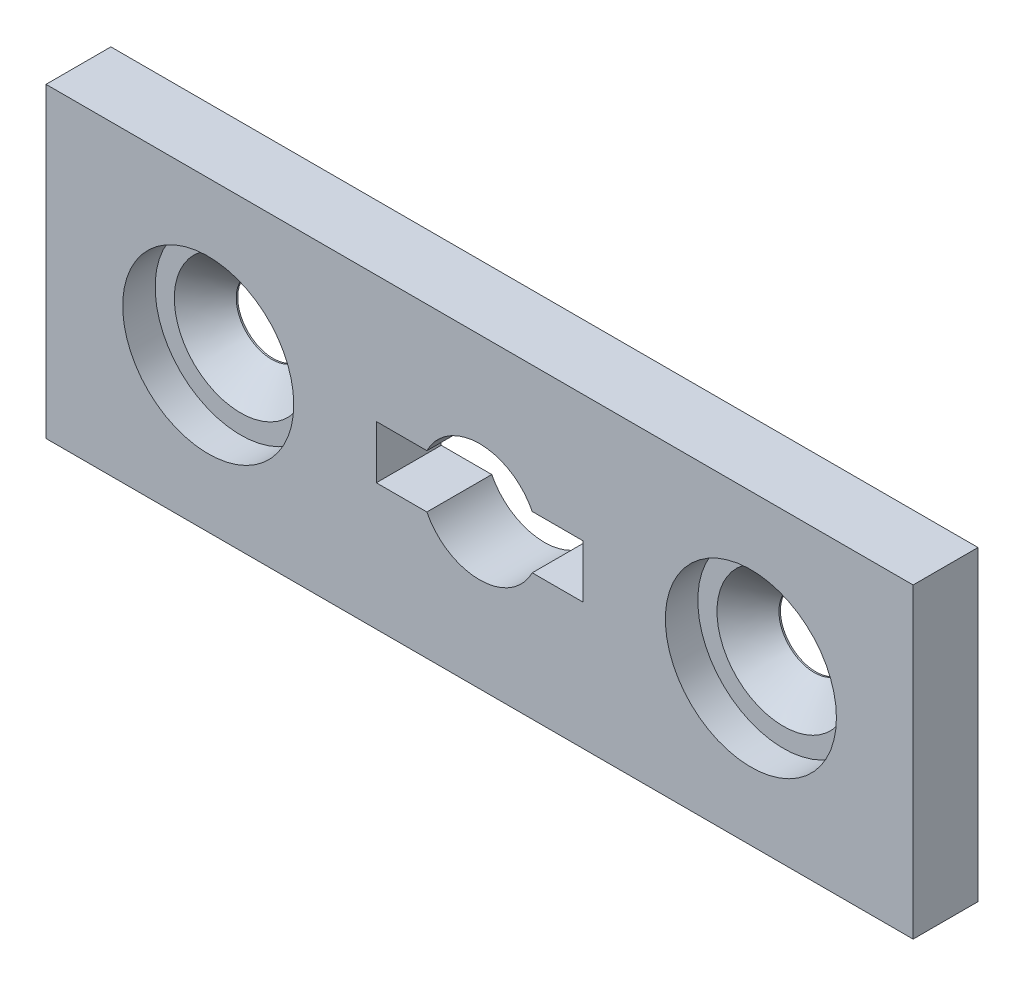
ISO-10303-21;
HEADER;
FILE_DESCRIPTION(('STEP AP214'),'2;1');
FILE_NAME('part.step','',(''),(''),'','','');
FILE_SCHEMA(('AUTOMOTIVE_DESIGN { 1 0 10303 214 1 1 1 1 }'));
ENDSEC;
DATA;
#1=APPLICATION_CONTEXT('core data for automotive mechanical design processes');
#2=APPLICATION_PROTOCOL_DEFINITION('international standard','automotive_design',2000,#1);
#3=PRODUCT_CONTEXT('',#1,'mechanical');
#4=PRODUCT('Part','Part','',(#3));
#5=PRODUCT_RELATED_PRODUCT_CATEGORY('part','',(#4));
#6=PRODUCT_DEFINITION_FORMATION('','',#4);
#7=PRODUCT_DEFINITION_CONTEXT('part definition',#1,'design');
#8=PRODUCT_DEFINITION('design','',#6,#7);
#9=PRODUCT_DEFINITION_SHAPE('','',#8);
#10=(LENGTH_UNIT() NAMED_UNIT(*) SI_UNIT(.MILLI.,.METRE.));
#11=(NAMED_UNIT(*) PLANE_ANGLE_UNIT() SI_UNIT($,.RADIAN.));
#12=(NAMED_UNIT(*) SI_UNIT($,.STERADIAN.) SOLID_ANGLE_UNIT());
#13=UNCERTAINTY_MEASURE_WITH_UNIT(LENGTH_MEASURE(1.E-05),#10,'distance_accuracy_value','');
#14=(GEOMETRIC_REPRESENTATION_CONTEXT(3) GLOBAL_UNCERTAINTY_ASSIGNED_CONTEXT((#13)) GLOBAL_UNIT_ASSIGNED_CONTEXT((#10,
#11,#12)) REPRESENTATION_CONTEXT('',''));
#15=CARTESIAN_POINT('',(0.,0.,0.));
#16=DIRECTION('',(0.,0.,1.));
#17=DIRECTION('',(1.,0.,0.));
#18=AXIS2_PLACEMENT_3D('',#15,#16,#17);
#19=CARTESIAN_POINT('',(0.,0.,-2.2));
#20=DIRECTION('',(0.,0.,1.));
#21=DIRECTION('',(1.,0.,0.));
#22=AXIS2_PLACEMENT_3D('',#19,#20,#21);
#23=CYLINDRICAL_SURFACE('',#22,2.);
#24=CARTESIAN_POINT('',(0.,0.,0.));
#25=DIRECTION('',(0.,0.,1.));
#26=DIRECTION('',(1.,0.,0.));
#27=AXIS2_PLACEMENT_3D('',#24,#25,#26);
#28=CIRCLE('',#27,2.);
#29=CARTESIAN_POINT('',(-1.78605710994918,-0.9,0.));
#30=VERTEX_POINT('',#29);
#31=CARTESIAN_POINT('',(1.78605710994918,-0.9,0.));
#32=VERTEX_POINT('',#31);
#33=EDGE_CURVE('E168',#30,#32,#28,.T.);
#34=ORIENTED_EDGE('',*,*,#33,.T.);
#35=DIRECTION('',(0.,0.,1.));
#36=VECTOR('',#35,1.);
#37=CARTESIAN_POINT('',(1.78605710994918,-0.9,-2.2));
#38=LINE('',#37,#36);
#39=CARTESIAN_POINT('',(1.78605710994918,-0.9,-2.2));
#40=VERTEX_POINT('',#39);
#41=EDGE_CURVE('E11',#32,#40,#38,.F.);
#42=ORIENTED_EDGE('',*,*,#41,.T.);
#43=CARTESIAN_POINT('',(0.,0.,-2.2));
#44=DIRECTION('',(0.,0.,1.));
#45=DIRECTION('',(1.,0.,0.));
#46=AXIS2_PLACEMENT_3D('',#43,#44,#45);
#47=CIRCLE('',#46,2.);
#48=CARTESIAN_POINT('',(-1.78605710994918,-0.9,-2.2));
#49=VERTEX_POINT('',#48);
#50=EDGE_CURVE('E176',#49,#40,#47,.T.);
#51=ORIENTED_EDGE('',*,*,#50,.F.);
#52=DIRECTION('',(0.,0.,1.));
#53=VECTOR('',#52,1.);
#54=CARTESIAN_POINT('',(-1.78605710994918,-0.9,-2.2));
#55=LINE('',#54,#53);
#56=EDGE_CURVE('E41',#49,#30,#55,.T.);
#57=ORIENTED_EDGE('',*,*,#56,.T.);
#58=EDGE_LOOP('',(#34,#42,#51,#57));
#59=FACE_BOUND('',#58,.T.);
#60=ADVANCED_FACE('F33',(#59),#23,.F.);
#61=CARTESIAN_POINT('',(14.7,-5.2,-2.2));
#62=DIRECTION('',(1.,0.,0.));
#63=DIRECTION('',(0.,0.,-1.));
#64=AXIS2_PLACEMENT_3D('',#61,#62,#63);
#65=PLANE('',#64);
#66=DIRECTION('',(0.,1.,0.));
#67=VECTOR('',#66,1.);
#68=CARTESIAN_POINT('',(14.7,-5.2,0.));
#69=LINE('',#68,#67);
#70=CARTESIAN_POINT('',(14.7,-5.2,0.));
#71=VERTEX_POINT('',#70);
#72=CARTESIAN_POINT('',(14.7,5.2,0.));
#73=VERTEX_POINT('',#72);
#74=EDGE_CURVE('E175',#71,#73,#69,.T.);
#75=ORIENTED_EDGE('',*,*,#74,.F.);
#76=DIRECTION('',(0.,0.,1.));
#77=VECTOR('',#76,1.);
#78=CARTESIAN_POINT('',(14.7,-5.2,-2.2));
#79=LINE('',#78,#77);
#80=CARTESIAN_POINT('',(14.7,-5.2,-2.2));
#81=VERTEX_POINT('',#80);
#82=EDGE_CURVE('E204',#81,#71,#79,.T.);
#83=ORIENTED_EDGE('',*,*,#82,.F.);
#84=DIRECTION('',(0.,1.,0.));
#85=VECTOR('',#84,1.);
#86=CARTESIAN_POINT('',(14.7,-5.2,-2.2));
#87=LINE('',#86,#85);
#88=CARTESIAN_POINT('',(14.7,5.2,-2.2));
#89=VERTEX_POINT('',#88);
#90=EDGE_CURVE('E180',#81,#89,#87,.T.);
#91=ORIENTED_EDGE('',*,*,#90,.T.);
#92=DIRECTION('',(0.,0.,1.));
#93=VECTOR('',#92,1.);
#94=CARTESIAN_POINT('',(14.7,5.2,-2.2));
#95=LINE('',#94,#93);
#96=EDGE_CURVE('E193',#89,#73,#95,.T.);
#97=ORIENTED_EDGE('',*,*,#96,.T.);
#98=EDGE_LOOP('',(#75,#83,#91,#97));
#99=FACE_BOUND('',#98,.T.);
#100=ADVANCED_FACE('F35',(#99),#65,.T.);
#101=CARTESIAN_POINT('',(-14.7,-5.2,-2.2));
#102=DIRECTION('',(0.,-1.,0.));
#103=DIRECTION('',(0.,0.,-1.));
#104=AXIS2_PLACEMENT_3D('',#101,#102,#103);
#105=PLANE('',#104);
#106=DIRECTION('',(1.,0.,0.));
#107=VECTOR('',#106,1.);
#108=CARTESIAN_POINT('',(-14.7,-5.2,0.));
#109=LINE('',#108,#107);
#110=CARTESIAN_POINT('',(-14.7,-5.2,0.));
#111=VERTEX_POINT('',#110);
#112=EDGE_CURVE('E184',#111,#71,#109,.T.);
#113=ORIENTED_EDGE('',*,*,#112,.F.);
#114=DIRECTION('',(0.,0.,1.));
#115=VECTOR('',#114,1.);
#116=CARTESIAN_POINT('',(-14.7,-5.2,-2.2));
#117=LINE('',#116,#115);
#118=CARTESIAN_POINT('',(-14.7,-5.2,-2.2));
#119=VERTEX_POINT('',#118);
#120=EDGE_CURVE('E206',#119,#111,#117,.T.);
#121=ORIENTED_EDGE('',*,*,#120,.F.);
#122=DIRECTION('',(1.,0.,0.));
#123=VECTOR('',#122,1.);
#124=CARTESIAN_POINT('',(-14.7,-5.2,-2.2));
#125=LINE('',#124,#123);
#126=EDGE_CURVE('E190',#119,#81,#125,.T.);
#127=ORIENTED_EDGE('',*,*,#126,.T.);
#128=ORIENTED_EDGE('',*,*,#82,.T.);
#129=EDGE_LOOP('',(#113,#121,#127,#128));
#130=FACE_BOUND('',#129,.T.);
#131=ADVANCED_FACE('F253',(#130),#105,.T.);
#132=CARTESIAN_POINT('',(-14.7,-5.2,-2.2));
#133=DIRECTION('',(-1.,0.,0.));
#134=DIRECTION('',(0.,0.,1.));
#135=AXIS2_PLACEMENT_3D('',#132,#133,#134);
#136=PLANE('',#135);
#137=DIRECTION('',(0.,-1.,0.));
#138=VECTOR('',#137,1.);
#139=CARTESIAN_POINT('',(-14.7,-5.2,0.));
#140=LINE('',#139,#138);
#141=CARTESIAN_POINT('',(-14.7,5.2,0.));
#142=VERTEX_POINT('',#141);
#143=EDGE_CURVE('E199',#142,#111,#140,.T.);
#144=ORIENTED_EDGE('',*,*,#143,.F.);
#145=DIRECTION('',(0.,0.,1.));
#146=VECTOR('',#145,1.);
#147=CARTESIAN_POINT('',(-14.7,5.2,-2.2));
#148=LINE('',#147,#146);
#149=CARTESIAN_POINT('',(-14.7,5.2,-2.2));
#150=VERTEX_POINT('',#149);
#151=EDGE_CURVE('E208',#150,#142,#148,.T.);
#152=ORIENTED_EDGE('',*,*,#151,.F.);
#153=DIRECTION('',(0.,-1.,0.));
#154=VECTOR('',#153,1.);
#155=CARTESIAN_POINT('',(-14.7,-5.2,-2.2));
#156=LINE('',#155,#154);
#157=EDGE_CURVE('E187',#150,#119,#156,.T.);
#158=ORIENTED_EDGE('',*,*,#157,.T.);
#159=ORIENTED_EDGE('',*,*,#120,.T.);
#160=EDGE_LOOP('',(#144,#152,#158,#159));
#161=FACE_BOUND('',#160,.T.);
#162=ADVANCED_FACE('F272',(#161),#136,.T.);
#163=CARTESIAN_POINT('',(-14.7,5.2,-2.2));
#164=DIRECTION('',(0.,1.,0.));
#165=DIRECTION('',(0.,0.,1.));
#166=AXIS2_PLACEMENT_3D('',#163,#164,#165);
#167=PLANE('',#166);
#168=DIRECTION('',(-1.,0.,0.));
#169=VECTOR('',#168,1.);
#170=CARTESIAN_POINT('',(-14.7,5.2,0.));
#171=LINE('',#170,#169);
#172=EDGE_CURVE('E196',#73,#142,#171,.T.);
#173=ORIENTED_EDGE('',*,*,#172,.F.);
#174=ORIENTED_EDGE('',*,*,#96,.F.);
#175=DIRECTION('',(-1.,0.,0.));
#176=VECTOR('',#175,1.);
#177=CARTESIAN_POINT('',(-14.7,5.2,-2.2));
#178=LINE('',#177,#176);
#179=EDGE_CURVE('E183',#89,#150,#178,.T.);
#180=ORIENTED_EDGE('',*,*,#179,.T.);
#181=ORIENTED_EDGE('',*,*,#151,.T.);
#182=EDGE_LOOP('',(#173,#174,#180,#181));
#183=FACE_BOUND('',#182,.T.);
#184=ADVANCED_FACE('F265',(#183),#167,.T.);
#185=CARTESIAN_POINT('',(14.7,5.2,-2.2));
#186=DIRECTION('',(0.,0.,-1.));
#187=DIRECTION('',(-1.,0.,0.));
#188=AXIS2_PLACEMENT_3D('',#185,#186,#187);
#189=PLANE('',#188);
#190=CARTESIAN_POINT('',(9.2,0.,-2.2));
#191=DIRECTION('',(0.,0.,1.));
#192=DIRECTION('',(1.,0.,0.));
#193=AXIS2_PLACEMENT_3D('',#190,#191,#192);
#194=CIRCLE('',#193,1.2);
#195=CARTESIAN_POINT('',(10.4,0.,-2.2));
#196=VERTEX_POINT('',#195);
#197=EDGE_CURVE('E480',#196,#196,#194,.T.);
#198=ORIENTED_EDGE('',*,*,#197,.T.);
#199=EDGE_LOOP('',(#198));
#200=FACE_BOUND('',#199,.T.);
#201=CARTESIAN_POINT('',(-9.2,0.,-2.2));
#202=DIRECTION('',(0.,0.,1.));
#203=DIRECTION('',(1.,0.,0.));
#204=AXIS2_PLACEMENT_3D('',#201,#202,#203);
#205=CIRCLE('',#204,1.2);
#206=CARTESIAN_POINT('',(-8.,0.,-2.2));
#207=VERTEX_POINT('',#206);
#208=EDGE_CURVE('E469',#207,#207,#205,.T.);
#209=ORIENTED_EDGE('',*,*,#208,.T.);
#210=EDGE_LOOP('',(#209));
#211=FACE_BOUND('',#210,.T.);
#212=DIRECTION('',(1.,0.,0.));
#213=VECTOR('',#212,1.);
#214=CARTESIAN_POINT('',(-3.5,-0.9,-2.2));
#215=LINE('',#214,#213);
#216=CARTESIAN_POINT('',(-3.5,-0.9,-2.2));
#217=VERTEX_POINT('',#216);
#218=EDGE_CURVE('E132',#217,#49,#215,.T.);
#219=ORIENTED_EDGE('',*,*,#218,.T.);
#220=ORIENTED_EDGE('',*,*,#50,.T.);
#221=CARTESIAN_POINT('',(3.5,-0.9,-2.2));
#222=VERTEX_POINT('',#221);
#223=EDGE_CURVE('E147',#40,#222,#215,.T.);
#224=ORIENTED_EDGE('',*,*,#223,.T.);
#225=DIRECTION('',(0.,1.,0.));
#226=VECTOR('',#225,1.);
#227=CARTESIAN_POINT('',(3.5,-0.9,-2.2));
#228=LINE('',#227,#226);
#229=CARTESIAN_POINT('',(3.5,0.9,-2.2));
#230=VERTEX_POINT('',#229);
#231=EDGE_CURVE('E127',#222,#230,#228,.T.);
#232=ORIENTED_EDGE('',*,*,#231,.T.);
#233=DIRECTION('',(-1.,0.,0.));
#234=VECTOR('',#233,1.);
#235=CARTESIAN_POINT('',(-3.5,0.9,-2.2));
#236=LINE('',#235,#234);
#237=CARTESIAN_POINT('',(1.78605710994918,0.9,-2.2));
#238=VERTEX_POINT('',#237);
#239=EDGE_CURVE('E135',#230,#238,#236,.T.);
#240=ORIENTED_EDGE('',*,*,#239,.T.);
#241=CARTESIAN_POINT('',(-1.78605710994918,0.9,-2.2));
#242=VERTEX_POINT('',#241);
#243=EDGE_CURVE('E173',#238,#242,#47,.T.);
#244=ORIENTED_EDGE('',*,*,#243,.T.);
#245=CARTESIAN_POINT('',(-3.5,0.9,-2.2));
#246=VERTEX_POINT('',#245);
#247=EDGE_CURVE('E56',#242,#246,#236,.T.);
#248=ORIENTED_EDGE('',*,*,#247,.T.);
#249=DIRECTION('',(0.,-1.,0.));
#250=VECTOR('',#249,1.);
#251=CARTESIAN_POINT('',(-3.5,-0.9,-2.2));
#252=LINE('',#251,#250);
#253=EDGE_CURVE('E141',#246,#217,#252,.T.);
#254=ORIENTED_EDGE('',*,*,#253,.T.);
#255=EDGE_LOOP('',(#219,#220,#224,#232,#240,#244,#248,#254));
#256=FACE_BOUND('',#255,.T.);
#257=ORIENTED_EDGE('',*,*,#90,.F.);
#258=ORIENTED_EDGE('',*,*,#126,.F.);
#259=ORIENTED_EDGE('',*,*,#157,.F.);
#260=ORIENTED_EDGE('',*,*,#179,.F.);
#261=EDGE_LOOP('',(#257,#258,#259,#260));
#262=FACE_BOUND('',#261,.T.);
#263=ADVANCED_FACE('F144',(#200,#211,#256,#262),#189,.T.);
#264=CARTESIAN_POINT('',(14.7,5.2,0.));
#265=DIRECTION('',(0.,0.,-1.));
#266=DIRECTION('',(-1.,0.,0.));
#267=AXIS2_PLACEMENT_3D('',#264,#265,#266);
#268=PLANE('',#267);
#269=CARTESIAN_POINT('',(-9.2,0.,0.));
#270=DIRECTION('',(0.,0.,1.));
#271=DIRECTION('',(1.,0.,0.));
#272=AXIS2_PLACEMENT_3D('',#269,#270,#271);
#273=CIRCLE('',#272,2.9);
#274=CARTESIAN_POINT('',(-6.3,0.,0.));
#275=VERTEX_POINT('',#274);
#276=EDGE_CURVE('E464',#275,#275,#273,.T.);
#277=ORIENTED_EDGE('',*,*,#276,.F.);
#278=EDGE_LOOP('',(#277));
#279=FACE_BOUND('',#278,.T.);
#280=CARTESIAN_POINT('',(9.2,0.,0.));
#281=DIRECTION('',(0.,0.,1.));
#282=DIRECTION('',(1.,0.,0.));
#283=AXIS2_PLACEMENT_3D('',#280,#281,#282);
#284=CIRCLE('',#283,2.9);
#285=CARTESIAN_POINT('',(12.1,0.,0.));
#286=VERTEX_POINT('',#285);
#287=EDGE_CURVE('E153',#286,#286,#284,.T.);
#288=ORIENTED_EDGE('',*,*,#287,.F.);
#289=EDGE_LOOP('',(#288));
#290=FACE_BOUND('',#289,.T.);
#291=ORIENTED_EDGE('',*,*,#33,.F.);
#292=DIRECTION('',(1.,0.,0.));
#293=VECTOR('',#292,1.);
#294=CARTESIAN_POINT('',(-3.5,-0.9,0.));
#295=LINE('',#294,#293);
#296=CARTESIAN_POINT('',(-3.5,-0.9,0.));
#297=VERTEX_POINT('',#296);
#298=EDGE_CURVE('E148',#297,#30,#295,.T.);
#299=ORIENTED_EDGE('',*,*,#298,.F.);
#300=DIRECTION('',(0.,-1.,0.));
#301=VECTOR('',#300,1.);
#302=CARTESIAN_POINT('',(-3.5,-0.9,0.));
#303=LINE('',#302,#301);
#304=CARTESIAN_POINT('',(-3.5,0.9,0.));
#305=VERTEX_POINT('',#304);
#306=EDGE_CURVE('E163',#305,#297,#303,.T.);
#307=ORIENTED_EDGE('',*,*,#306,.F.);
#308=DIRECTION('',(-1.,0.,0.));
#309=VECTOR('',#308,1.);
#310=CARTESIAN_POINT('',(-3.5,0.9,0.));
#311=LINE('',#310,#309);
#312=CARTESIAN_POINT('',(-1.78605710994918,0.9,0.));
#313=VERTEX_POINT('',#312);
#314=EDGE_CURVE('E160',#313,#305,#311,.T.);
#315=ORIENTED_EDGE('',*,*,#314,.F.);
#316=CARTESIAN_POINT('',(1.78605710994918,0.9,0.));
#317=VERTEX_POINT('',#316);
#318=EDGE_CURVE('E177',#317,#313,#28,.T.);
#319=ORIENTED_EDGE('',*,*,#318,.F.);
#320=CARTESIAN_POINT('',(3.5,0.9,0.));
#321=VERTEX_POINT('',#320);
#322=EDGE_CURVE('E48',#321,#317,#311,.T.);
#323=ORIENTED_EDGE('',*,*,#322,.F.);
#324=DIRECTION('',(0.,1.,0.));
#325=VECTOR('',#324,1.);
#326=CARTESIAN_POINT('',(3.5,-0.9,0.));
#327=LINE('',#326,#325);
#328=CARTESIAN_POINT('',(3.5,-0.9,0.));
#329=VERTEX_POINT('',#328);
#330=EDGE_CURVE('E130',#329,#321,#327,.T.);
#331=ORIENTED_EDGE('',*,*,#330,.F.);
#332=EDGE_CURVE('E150',#32,#329,#295,.T.);
#333=ORIENTED_EDGE('',*,*,#332,.F.);
#334=EDGE_LOOP('',(#291,#299,#307,#315,#319,#323,#331,#333));
#335=FACE_BOUND('',#334,.T.);
#336=ORIENTED_EDGE('',*,*,#74,.T.);
#337=ORIENTED_EDGE('',*,*,#172,.T.);
#338=ORIENTED_EDGE('',*,*,#143,.T.);
#339=ORIENTED_EDGE('',*,*,#112,.T.);
#340=EDGE_LOOP('',(#336,#337,#338,#339));
#341=FACE_BOUND('',#340,.T.);
#342=ADVANCED_FACE('F223',(#279,#290,#335,#341),#268,.F.);
#343=ORIENTED_EDGE('',*,*,#318,.T.);
#344=DIRECTION('',(0.,0.,1.));
#345=VECTOR('',#344,1.);
#346=CARTESIAN_POINT('',(-1.78605710994918,0.9,-2.2));
#347=LINE('',#346,#345);
#348=EDGE_CURVE('E212',#313,#242,#347,.F.);
#349=ORIENTED_EDGE('',*,*,#348,.T.);
#350=ORIENTED_EDGE('',*,*,#243,.F.);
#351=DIRECTION('',(0.,0.,1.));
#352=VECTOR('',#351,1.);
#353=CARTESIAN_POINT('',(1.78605710994918,0.9,-2.2));
#354=LINE('',#353,#352);
#355=EDGE_CURVE('E137',#238,#317,#354,.T.);
#356=ORIENTED_EDGE('',*,*,#355,.T.);
#357=EDGE_LOOP('',(#343,#349,#350,#356));
#358=FACE_BOUND('',#357,.T.);
#359=ADVANCED_FACE('F235',(#358),#23,.F.);
#360=CARTESIAN_POINT('',(-3.5,0.9,-2.2));
#361=DIRECTION('',(0.,1.,0.));
#362=DIRECTION('',(0.,0.,1.));
#363=AXIS2_PLACEMENT_3D('',#360,#361,#362);
#364=PLANE('',#363);
#365=ORIENTED_EDGE('',*,*,#239,.F.);
#366=DIRECTION('',(0.,0.,1.));
#367=VECTOR('',#366,1.);
#368=CARTESIAN_POINT('',(3.5,0.9,-2.2));
#369=LINE('',#368,#367);
#370=EDGE_CURVE('E122',#230,#321,#369,.T.);
#371=ORIENTED_EDGE('',*,*,#370,.T.);
#372=ORIENTED_EDGE('',*,*,#322,.T.);
#373=ORIENTED_EDGE('',*,*,#355,.F.);
#374=EDGE_LOOP('',(#365,#371,#372,#373));
#375=FACE_BOUND('',#374,.T.);
#376=ADVANCED_FACE('F136',(#375),#364,.F.);
#377=CARTESIAN_POINT('',(-3.5,-0.9,-2.2));
#378=DIRECTION('',(0.,-1.,0.));
#379=DIRECTION('',(0.,0.,-1.));
#380=AXIS2_PLACEMENT_3D('',#377,#378,#379);
#381=PLANE('',#380);
#382=ORIENTED_EDGE('',*,*,#332,.T.);
#383=DIRECTION('',(0.,0.,1.));
#384=VECTOR('',#383,1.);
#385=CARTESIAN_POINT('',(3.5,-0.9,-2.2));
#386=LINE('',#385,#384);
#387=EDGE_CURVE('E166',#222,#329,#386,.T.);
#388=ORIENTED_EDGE('',*,*,#387,.F.);
#389=ORIENTED_EDGE('',*,*,#223,.F.);
#390=ORIENTED_EDGE('',*,*,#41,.F.);
#391=EDGE_LOOP('',(#382,#388,#389,#390));
#392=FACE_BOUND('',#391,.T.);
#393=ADVANCED_FACE('F227',(#392),#381,.F.);
#394=CARTESIAN_POINT('',(3.5,-0.9,-2.2));
#395=DIRECTION('',(1.,0.,0.));
#396=DIRECTION('',(0.,0.,-1.));
#397=AXIS2_PLACEMENT_3D('',#394,#395,#396);
#398=PLANE('',#397);
#399=ORIENTED_EDGE('',*,*,#330,.T.);
#400=ORIENTED_EDGE('',*,*,#370,.F.);
#401=ORIENTED_EDGE('',*,*,#231,.F.);
#402=ORIENTED_EDGE('',*,*,#387,.T.);
#403=EDGE_LOOP('',(#399,#400,#401,#402));
#404=FACE_BOUND('',#403,.T.);
#405=ADVANCED_FACE('F124',(#404),#398,.F.);
#406=ORIENTED_EDGE('',*,*,#218,.F.);
#407=DIRECTION('',(0.,0.,1.));
#408=VECTOR('',#407,1.);
#409=CARTESIAN_POINT('',(-3.5,-0.9,-2.2));
#410=LINE('',#409,#408);
#411=EDGE_CURVE('E169',#217,#297,#410,.T.);
#412=ORIENTED_EDGE('',*,*,#411,.T.);
#413=ORIENTED_EDGE('',*,*,#298,.T.);
#414=ORIENTED_EDGE('',*,*,#56,.F.);
#415=EDGE_LOOP('',(#406,#412,#413,#414));
#416=FACE_BOUND('',#415,.T.);
#417=ADVANCED_FACE('F229',(#416),#381,.F.);
#418=ORIENTED_EDGE('',*,*,#314,.T.);
#419=DIRECTION('',(0.,0.,1.));
#420=VECTOR('',#419,1.);
#421=CARTESIAN_POINT('',(-3.5,0.9,-2.2));
#422=LINE('',#421,#420);
#423=EDGE_CURVE('E131',#246,#305,#422,.T.);
#424=ORIENTED_EDGE('',*,*,#423,.F.);
#425=ORIENTED_EDGE('',*,*,#247,.F.);
#426=ORIENTED_EDGE('',*,*,#348,.F.);
#427=EDGE_LOOP('',(#418,#424,#425,#426));
#428=FACE_BOUND('',#427,.T.);
#429=ADVANCED_FACE('F236',(#428),#364,.F.);
#430=CARTESIAN_POINT('',(-3.5,-0.9,-2.2));
#431=DIRECTION('',(-1.,0.,0.));
#432=DIRECTION('',(0.,0.,1.));
#433=AXIS2_PLACEMENT_3D('',#430,#431,#432);
#434=PLANE('',#433);
#435=ORIENTED_EDGE('',*,*,#306,.T.);
#436=ORIENTED_EDGE('',*,*,#411,.F.);
#437=ORIENTED_EDGE('',*,*,#253,.F.);
#438=ORIENTED_EDGE('',*,*,#423,.T.);
#439=EDGE_LOOP('',(#435,#436,#437,#438));
#440=FACE_BOUND('',#439,.T.);
#441=ADVANCED_FACE('F231',(#440),#434,.F.);
#442=CARTESIAN_POINT('',(9.2,0.,-1.1));
#443=DIRECTION('',(0.,0.,1.));
#444=DIRECTION('',(1.,0.,0.));
#445=AXIS2_PLACEMENT_3D('',#442,#443,#444);
#446=CYLINDRICAL_SURFACE('',#445,2.9);
#447=CARTESIAN_POINT('',(9.2,0.,-1.1));
#448=DIRECTION('',(0.,0.,1.));
#449=DIRECTION('',(1.,0.,0.));
#450=AXIS2_PLACEMENT_3D('',#447,#448,#449);
#451=CIRCLE('',#450,2.9);
#452=CARTESIAN_POINT('',(12.1,0.,-1.1));
#453=VERTEX_POINT('',#452);
#454=EDGE_CURVE('E161',#453,#453,#451,.T.);
#455=ORIENTED_EDGE('',*,*,#454,.F.);
#456=EDGE_LOOP('',(#455));
#457=FACE_BOUND('',#456,.T.);
#458=ORIENTED_EDGE('',*,*,#287,.T.);
#459=EDGE_LOOP('',(#458));
#460=FACE_BOUND('',#459,.T.);
#461=ADVANCED_FACE('F243',(#457,#460),#446,.F.);
#462=CARTESIAN_POINT('',(9.2,0.,-1.1));
#463=DIRECTION('',(0.,0.,1.));
#464=DIRECTION('',(1.,0.,0.));
#465=AXIS2_PLACEMENT_3D('',#462,#463,#464);
#466=PLANE('',#465);
#467=CARTESIAN_POINT('',(9.2,0.,-1.1));
#468=DIRECTION('',(0.,0.,1.));
#469=DIRECTION('',(1.,0.,0.));
#470=AXIS2_PLACEMENT_3D('',#467,#468,#469);
#471=CIRCLE('',#470,2.25);
#472=CARTESIAN_POINT('',(11.45,0.,-1.1));
#473=VERTEX_POINT('',#472);
#474=EDGE_CURVE('E486',#473,#473,#471,.T.);
#475=ORIENTED_EDGE('',*,*,#474,.F.);
#476=EDGE_LOOP('',(#475));
#477=FACE_BOUND('',#476,.T.);
#478=ORIENTED_EDGE('',*,*,#454,.T.);
#479=EDGE_LOOP('',(#478));
#480=FACE_BOUND('',#479,.T.);
#481=ADVANCED_FACE('F307',(#477,#480),#466,.T.);
#482=CARTESIAN_POINT('',(-9.2,0.,-1.1));
#483=DIRECTION('',(0.,0.,1.));
#484=DIRECTION('',(1.,0.,0.));
#485=AXIS2_PLACEMENT_3D('',#482,#483,#484);
#486=CYLINDRICAL_SURFACE('',#485,2.9);
#487=CARTESIAN_POINT('',(-9.2,0.,-1.1));
#488=DIRECTION('',(0.,0.,1.));
#489=DIRECTION('',(1.,0.,0.));
#490=AXIS2_PLACEMENT_3D('',#487,#488,#489);
#491=CIRCLE('',#490,2.9);
#492=CARTESIAN_POINT('',(-6.3,0.,-1.1));
#493=VERTEX_POINT('',#492);
#494=EDGE_CURVE('E462',#493,#493,#491,.T.);
#495=ORIENTED_EDGE('',*,*,#494,.F.);
#496=EDGE_LOOP('',(#495));
#497=FACE_BOUND('',#496,.T.);
#498=ORIENTED_EDGE('',*,*,#276,.T.);
#499=EDGE_LOOP('',(#498));
#500=FACE_BOUND('',#499,.T.);
#501=ADVANCED_FACE('F312',(#497,#500),#486,.F.);
#502=CARTESIAN_POINT('',(-9.2,0.,-1.1));
#503=DIRECTION('',(0.,0.,1.));
#504=DIRECTION('',(1.,0.,0.));
#505=AXIS2_PLACEMENT_3D('',#502,#503,#504);
#506=PLANE('',#505);
#507=CARTESIAN_POINT('',(-9.2,0.,-1.1));
#508=DIRECTION('',(0.,0.,1.));
#509=DIRECTION('',(1.,0.,0.));
#510=AXIS2_PLACEMENT_3D('',#507,#508,#509);
#511=CIRCLE('',#510,2.25);
#512=CARTESIAN_POINT('',(-6.95,0.,-1.1));
#513=VERTEX_POINT('',#512);
#514=EDGE_CURVE('E477',#513,#513,#511,.T.);
#515=ORIENTED_EDGE('',*,*,#514,.F.);
#516=EDGE_LOOP('',(#515));
#517=FACE_BOUND('',#516,.T.);
#518=ORIENTED_EDGE('',*,*,#494,.T.);
#519=EDGE_LOOP('',(#518));
#520=FACE_BOUND('',#519,.T.);
#521=ADVANCED_FACE('F349',(#517,#520),#506,.T.);
#522=CARTESIAN_POINT('',(-9.2,0.,-1.1));
#523=DIRECTION('',(0.,0.,1.));
#524=DIRECTION('',(1.,0.,0.));
#525=AXIS2_PLACEMENT_3D('',#522,#523,#524);
#526=CYLINDRICAL_SURFACE('',#525,1.2);
#527=ORIENTED_EDGE('',*,*,#208,.F.);
#528=EDGE_LOOP('',(#527));
#529=FACE_BOUND('',#528,.T.);
#530=CARTESIAN_POINT('',(-9.2,0.,-2.15));
#531=DIRECTION('',(0.,0.,1.));
#532=DIRECTION('',(1.,0.,0.));
#533=AXIS2_PLACEMENT_3D('',#530,#531,#532);
#534=CIRCLE('',#533,1.2);
#535=CARTESIAN_POINT('',(-8.,0.,-2.15));
#536=VERTEX_POINT('',#535);
#537=EDGE_CURVE('E474',#536,#536,#534,.T.);
#538=ORIENTED_EDGE('',*,*,#537,.T.);
#539=EDGE_LOOP('',(#538));
#540=FACE_BOUND('',#539,.T.);
#541=ADVANCED_FACE('F345',(#529,#540),#526,.F.);
#542=CARTESIAN_POINT('',(-9.2,0.,-1.1));
#543=DIRECTION('',(0.,0.,1.));
#544=DIRECTION('',(1.,0.,0.));
#545=AXIS2_PLACEMENT_3D('',#542,#543,#544);
#546=CONICAL_SURFACE('',#545,2.25,0.785398163397448);
#547=ORIENTED_EDGE('',*,*,#537,.F.);
#548=EDGE_LOOP('',(#547));
#549=FACE_BOUND('',#548,.T.);
#550=ORIENTED_EDGE('',*,*,#514,.T.);
#551=EDGE_LOOP('',(#550));
#552=FACE_BOUND('',#551,.T.);
#553=ADVANCED_FACE('F302',(#549,#552),#546,.F.);
#554=CARTESIAN_POINT('',(9.2,0.,-1.1));
#555=DIRECTION('',(0.,0.,1.));
#556=DIRECTION('',(1.,0.,0.));
#557=AXIS2_PLACEMENT_3D('',#554,#555,#556);
#558=CYLINDRICAL_SURFACE('',#557,1.19999999999999);
#559=ORIENTED_EDGE('',*,*,#197,.F.);
#560=EDGE_LOOP('',(#559));
#561=FACE_BOUND('',#560,.T.);
#562=CARTESIAN_POINT('',(9.2,0.,-2.15000000000001));
#563=DIRECTION('',(0.,0.,1.));
#564=DIRECTION('',(1.,0.,0.));
#565=AXIS2_PLACEMENT_3D('',#562,#563,#564);
#566=CIRCLE('',#565,1.19999999999999);
#567=CARTESIAN_POINT('',(10.4,0.,-2.15000000000001));
#568=VERTEX_POINT('',#567);
#569=EDGE_CURVE('E483',#568,#568,#566,.T.);
#570=ORIENTED_EDGE('',*,*,#569,.T.);
#571=EDGE_LOOP('',(#570));
#572=FACE_BOUND('',#571,.T.);
#573=ADVANCED_FACE('F322',(#561,#572),#558,.F.);
#574=CARTESIAN_POINT('',(9.2,0.,-1.1));
#575=DIRECTION('',(0.,0.,1.));
#576=DIRECTION('',(1.,0.,0.));
#577=AXIS2_PLACEMENT_3D('',#574,#575,#576);
#578=CONICAL_SURFACE('',#577,2.25,0.785398163397449);
#579=ORIENTED_EDGE('',*,*,#569,.F.);
#580=EDGE_LOOP('',(#579));
#581=FACE_BOUND('',#580,.T.);
#582=ORIENTED_EDGE('',*,*,#474,.T.);
#583=EDGE_LOOP('',(#582));
#584=FACE_BOUND('',#583,.T.);
#585=ADVANCED_FACE('F327',(#581,#584),#578,.F.);
#586=CLOSED_SHELL('',(#60,#100,#131,#162,#184,#263,#342,#359,#376,#393,#405,#417,#429,#441,#461,
#481,#501,#521,#541,#553,#573,#585));
#587=MANIFOLD_SOLID_BREP('B2',#586);
#588=ADVANCED_BREP_SHAPE_REPRESENTATION('',(#18,#587),#14);
#589=SHAPE_DEFINITION_REPRESENTATION(#9,#588);
ENDSEC;
END-ISO-10303-21;
